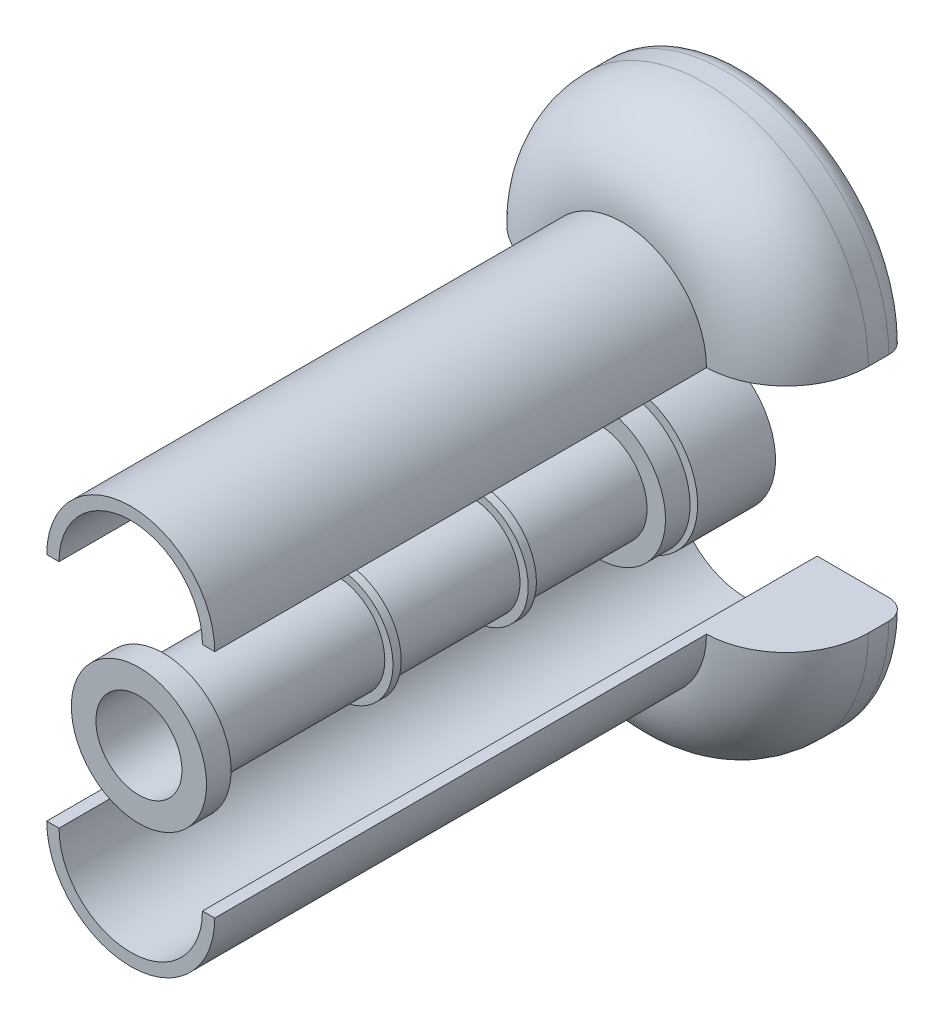
ISO-10303-21;
HEADER;
FILE_DESCRIPTION(('STEP AP214'),'2;1');
FILE_NAME('part.step','',(''),(''),'','','');
FILE_SCHEMA(('AUTOMOTIVE_DESIGN { 1 0 10303 214 1 1 1 1 }'));
ENDSEC;
DATA;
#1=APPLICATION_CONTEXT('core data for automotive mechanical design processes');
#2=APPLICATION_PROTOCOL_DEFINITION('international standard','automotive_design',2000,#1);
#3=PRODUCT_CONTEXT('',#1,'mechanical');
#4=PRODUCT('Part','Part','',(#3));
#5=PRODUCT_RELATED_PRODUCT_CATEGORY('part','',(#4));
#6=PRODUCT_DEFINITION_FORMATION('','',#4);
#7=PRODUCT_DEFINITION_CONTEXT('part definition',#1,'design');
#8=PRODUCT_DEFINITION('design','',#6,#7);
#9=PRODUCT_DEFINITION_SHAPE('','',#8);
#10=(LENGTH_UNIT() NAMED_UNIT(*) SI_UNIT(.MILLI.,.METRE.));
#11=(NAMED_UNIT(*) PLANE_ANGLE_UNIT() SI_UNIT($,.RADIAN.));
#12=(NAMED_UNIT(*) SI_UNIT($,.STERADIAN.) SOLID_ANGLE_UNIT());
#13=UNCERTAINTY_MEASURE_WITH_UNIT(LENGTH_MEASURE(1.E-05),#10,'distance_accuracy_value','');
#14=(GEOMETRIC_REPRESENTATION_CONTEXT(3) GLOBAL_UNCERTAINTY_ASSIGNED_CONTEXT((#13)) GLOBAL_UNIT_ASSIGNED_CONTEXT((#10,
#11,#12)) REPRESENTATION_CONTEXT('',''));
#15=CARTESIAN_POINT('',(0.,0.,0.));
#16=DIRECTION('',(0.,0.,1.));
#17=DIRECTION('',(1.,0.,0.));
#18=AXIS2_PLACEMENT_3D('',#15,#16,#17);
#19=CARTESIAN_POINT('',(0.,-25.237978412694,0.));
#20=DIRECTION('',(0.,1.,0.));
#21=DIRECTION('',(0.,0.,1.));
#22=AXIS2_PLACEMENT_3D('',#19,#20,#21);
#23=PLANE('',#22);
#24=DIRECTION('',(0.,0.,1.));
#25=VECTOR('',#24,1.);
#26=CARTESIAN_POINT('',(17.5,-25.237978412694,-35.));
#27=LINE('',#26,#25);
#28=CARTESIAN_POINT('',(17.5,-25.237978412694,-30.0000000000001));
#29=VERTEX_POINT('',#28);
#30=CARTESIAN_POINT('',(17.5,-25.237978412694,120.));
#31=VERTEX_POINT('',#30);
#32=EDGE_CURVE('E112',#29,#31,#27,.T.);
#33=ORIENTED_EDGE('',*,*,#32,.T.);
#34=DIRECTION('',(-1.,0.,0.));
#35=VECTOR('',#34,1.);
#36=CARTESIAN_POINT('',(0.,-25.237978412694,120.));
#37=LINE('',#36,#35);
#38=CARTESIAN_POINT('',(20.5,-25.237978412694,120.));
#39=VERTEX_POINT('',#38);
#40=EDGE_CURVE('E116',#39,#31,#37,.T.);
#41=ORIENTED_EDGE('',*,*,#40,.F.);
#42=DIRECTION('',(0.,0.,-1.));
#43=VECTOR('',#42,1.);
#44=CARTESIAN_POINT('',(20.5,-25.237978412694,120.));
#45=LINE('',#44,#43);
#46=CARTESIAN_POINT('',(20.5,-25.237978412694,0.));
#47=VERTEX_POINT('',#46);
#48=EDGE_CURVE('E136',#39,#47,#45,.T.);
#49=ORIENTED_EDGE('',*,*,#48,.T.);
#50=DIRECTION('',(-1.,0.,0.));
#51=VECTOR('',#50,1.);
#52=CARTESIAN_POINT('',(0.,-25.237978412694,0.));
#53=LINE('',#52,#51);
#54=CARTESIAN_POINT('',(19.9999999999999,-25.237978412694,0.));
#55=VERTEX_POINT('',#54);
#56=EDGE_CURVE('E143',#47,#55,#53,.T.);
#57=ORIENTED_EDGE('',*,*,#56,.T.);
#58=CARTESIAN_POINT('',(19.9999999999999,-25.237978412694,-20.0000000000001));
#59=DIRECTION('',(0.,1.,0.));
#60=DIRECTION('',(0.,0.,1.));
#61=AXIS2_PLACEMENT_3D('',#58,#59,#60);
#62=CIRCLE('',#61,20.);
#63=CARTESIAN_POINT('',(39.9999999999999,-25.237978412694,-20.0000000000003));
#64=VERTEX_POINT('',#63);
#65=EDGE_CURVE('E153',#64,#55,#62,.F.);
#66=ORIENTED_EDGE('',*,*,#65,.F.);
#67=DIRECTION('',(0.,0.,1.));
#68=VECTOR('',#67,1.);
#69=CARTESIAN_POINT('',(39.9999999999998,-25.237978412694,-30.0000000000003));
#70=LINE('',#69,#68);
#71=CARTESIAN_POINT('',(39.9999999999998,-25.237978412694,-25.0000000000003));
#72=VERTEX_POINT('',#71);
#73=EDGE_CURVE('E159',#64,#72,#70,.F.);
#74=ORIENTED_EDGE('',*,*,#73,.T.);
#75=CARTESIAN_POINT('',(34.9999999999998,-25.237978412694,-25.0000000000002));
#76=DIRECTION('',(0.,1.,0.));
#77=DIRECTION('',(0.,0.,1.));
#78=AXIS2_PLACEMENT_3D('',#75,#76,#77);
#79=CIRCLE('',#78,5.);
#80=CARTESIAN_POINT('',(34.9999999999998,-25.237978412694,-30.0000000000002));
#81=VERTEX_POINT('',#80);
#82=EDGE_CURVE('E69',#81,#72,#79,.F.);
#83=ORIENTED_EDGE('',*,*,#82,.F.);
#84=DIRECTION('',(1.,0.,0.));
#85=VECTOR('',#84,1.);
#86=CARTESIAN_POINT('',(-2.09488880330588E-13,-25.237978412694,-30.));
#87=LINE('',#86,#85);
#88=EDGE_CURVE('E119',#29,#81,#87,.T.);
#89=ORIENTED_EDGE('',*,*,#88,.F.);
#90=EDGE_LOOP('',(#33,#41,#49,#57,#66,#74,#83,#89));
#91=FACE_BOUND('',#90,.T.);
#92=ADVANCED_FACE('F46',(#91),#23,.T.);
#93=CARTESIAN_POINT('',(-20.0000000000001,-25.237978412694,-19.9999999999999));
#94=DIRECTION('',(0.,1.,0.));
#95=DIRECTION('',(0.,0.,1.));
#96=AXIS2_PLACEMENT_3D('',#93,#94,#95);
#97=CIRCLE('',#96,20.);
#98=CARTESIAN_POINT('',(-20.,-25.237978412694,1.39218565815935E-13));
#99=VERTEX_POINT('',#98);
#100=CARTESIAN_POINT('',(-40.0000000000001,-25.237978412694,-19.9999999999997));
#101=VERTEX_POINT('',#100);
#102=EDGE_CURVE('E151',#99,#101,#97,.F.);
#103=ORIENTED_EDGE('',*,*,#102,.F.);
#104=CARTESIAN_POINT('',(-20.5,-25.237978412694,0.));
#105=VERTEX_POINT('',#104);
#106=EDGE_CURVE('E144',#99,#105,#53,.T.);
#107=ORIENTED_EDGE('',*,*,#106,.T.);
#108=DIRECTION('',(0.,0.,-1.));
#109=VECTOR('',#108,1.);
#110=CARTESIAN_POINT('',(-20.5,-25.237978412694,120.));
#111=LINE('',#110,#109);
#112=CARTESIAN_POINT('',(-20.5,-25.237978412694,120.));
#113=VERTEX_POINT('',#112);
#114=EDGE_CURVE('E138',#105,#113,#111,.F.);
#115=ORIENTED_EDGE('',*,*,#114,.T.);
#116=CARTESIAN_POINT('',(-17.5,-25.237978412694,120.));
#117=VERTEX_POINT('',#116);
#118=EDGE_CURVE('E135',#117,#113,#37,.T.);
#119=ORIENTED_EDGE('',*,*,#118,.F.);
#120=DIRECTION('',(0.,0.,1.));
#121=VECTOR('',#120,1.);
#122=CARTESIAN_POINT('',(-17.5,-25.237978412694,-35.));
#123=LINE('',#122,#121);
#124=CARTESIAN_POINT('',(-17.5,-25.237978412694,-29.9999999999999));
#125=VERTEX_POINT('',#124);
#126=EDGE_CURVE('E121',#117,#125,#123,.F.);
#127=ORIENTED_EDGE('',*,*,#126,.T.);
#128=CARTESIAN_POINT('',(-35.0000000000002,-25.237978412694,-29.9999999999998));
#129=VERTEX_POINT('',#128);
#130=EDGE_CURVE('E156',#129,#125,#87,.T.);
#131=ORIENTED_EDGE('',*,*,#130,.F.);
#132=CARTESIAN_POINT('',(-35.0000000000002,-25.237978412694,-24.9999999999998));
#133=DIRECTION('',(0.,1.,0.));
#134=DIRECTION('',(0.,0.,1.));
#135=AXIS2_PLACEMENT_3D('',#132,#133,#134);
#136=CIRCLE('',#135,5.);
#137=CARTESIAN_POINT('',(-40.0000000000002,-25.237978412694,-24.9999999999997));
#138=VERTEX_POINT('',#137);
#139=EDGE_CURVE('E61',#138,#129,#136,.F.);
#140=ORIENTED_EDGE('',*,*,#139,.F.);
#141=DIRECTION('',(0.,0.,1.));
#142=VECTOR('',#141,1.);
#143=CARTESIAN_POINT('',(-40.0000000000002,-25.237978412694,-29.9999999999997));
#144=LINE('',#143,#142);
#145=EDGE_CURVE('E157',#138,#101,#144,.T.);
#146=ORIENTED_EDGE('',*,*,#145,.T.);
#147=EDGE_LOOP('',(#103,#107,#115,#119,#127,#131,#140,#146));
#148=FACE_BOUND('',#147,.T.);
#149=ADVANCED_FACE('F177',(#148),#23,.T.);
#150=CARTESIAN_POINT('',(-1.74574066942157E-13,-25.237978412694,-25.));
#151=DIRECTION('',(0.,0.,-1.));
#152=DIRECTION('',(-1.,0.,0.));
#153=AXIS2_PLACEMENT_3D('',#150,#151,#152);
#154=TOROIDAL_SURFACE('',#153,35.,5.);
#155=CARTESIAN_POINT('',(-2.09488880330588E-13,-25.237978412694,-30.));
#156=DIRECTION('',(0.,0.,-1.));
#157=DIRECTION('',(-1.,0.,0.));
#158=AXIS2_PLACEMENT_3D('',#155,#156,#157);
#159=CIRCLE('',#158,35.);
#160=EDGE_CURVE('E164',#81,#129,#159,.T.);
#161=ORIENTED_EDGE('',*,*,#160,.F.);
#162=ORIENTED_EDGE('',*,*,#82,.T.);
#163=CARTESIAN_POINT('',(-1.74574066942157E-13,-25.237978412694,-25.));
#164=DIRECTION('',(0.,0.,-1.));
#165=DIRECTION('',(-1.,0.,0.));
#166=AXIS2_PLACEMENT_3D('',#163,#164,#165);
#167=CIRCLE('',#166,40.);
#168=EDGE_CURVE('E149',#138,#72,#167,.F.);
#169=ORIENTED_EDGE('',*,*,#168,.F.);
#170=ORIENTED_EDGE('',*,*,#139,.T.);
#171=EDGE_LOOP('',(#161,#162,#169,#170));
#172=FACE_BOUND('',#171,.T.);
#173=ADVANCED_FACE('F179',(#172),#154,.T.);
#174=CARTESIAN_POINT('',(-2.09488880330588E-13,-25.237978412694,-30.));
#175=DIRECTION('',(0.,0.,-1.));
#176=DIRECTION('',(-1.,0.,0.));
#177=AXIS2_PLACEMENT_3D('',#174,#175,#176);
#178=PLANE('',#177);
#179=ORIENTED_EDGE('',*,*,#160,.T.);
#180=ORIENTED_EDGE('',*,*,#130,.T.);
#181=CARTESIAN_POINT('',(0.,-25.237978412694,-30.));
#182=DIRECTION('',(0.,0.,-1.));
#183=DIRECTION('',(-1.,0.,0.));
#184=AXIS2_PLACEMENT_3D('',#181,#182,#183);
#185=CIRCLE('',#184,17.5);
#186=EDGE_CURVE('E13',#29,#125,#185,.T.);
#187=ORIENTED_EDGE('',*,*,#186,.F.);
#188=ORIENTED_EDGE('',*,*,#88,.T.);
#189=EDGE_LOOP('',(#179,#180,#187,#188));
#190=FACE_BOUND('',#189,.T.);
#191=ADVANCED_FACE('F185',(#190),#178,.T.);
#192=CARTESIAN_POINT('',(-2.09488880330588E-13,-25.237978412694,-30.));
#193=DIRECTION('',(0.,0.,1.));
#194=DIRECTION('',(1.,0.,0.));
#195=AXIS2_PLACEMENT_3D('',#192,#193,#194);
#196=CYLINDRICAL_SURFACE('',#195,40.);
#197=ORIENTED_EDGE('',*,*,#145,.F.);
#198=ORIENTED_EDGE('',*,*,#168,.T.);
#199=ORIENTED_EDGE('',*,*,#73,.F.);
#200=CARTESIAN_POINT('',(-1.39659253553725E-13,-25.237978412694,-20.));
#201=DIRECTION('',(0.,0.,-1.));
#202=DIRECTION('',(-1.,0.,0.));
#203=AXIS2_PLACEMENT_3D('',#200,#201,#202);
#204=CIRCLE('',#203,40.);
#205=EDGE_CURVE('E54',#64,#101,#204,.T.);
#206=ORIENTED_EDGE('',*,*,#205,.T.);
#207=EDGE_LOOP('',(#197,#198,#199,#206));
#208=FACE_BOUND('',#207,.T.);
#209=ADVANCED_FACE('F173',(#208),#196,.T.);
#210=CARTESIAN_POINT('',(0.,-25.237978412694,-35.));
#211=DIRECTION('',(0.,0.,1.));
#212=DIRECTION('',(1.,0.,0.));
#213=AXIS2_PLACEMENT_3D('',#210,#211,#212);
#214=CYLINDRICAL_SURFACE('',#213,17.5);
#215=ORIENTED_EDGE('',*,*,#126,.F.);
#216=CARTESIAN_POINT('',(0.,-25.237978412694,120.));
#217=DIRECTION('',(0.,0.,1.));
#218=DIRECTION('',(1.,0.,0.));
#219=AXIS2_PLACEMENT_3D('',#216,#217,#218);
#220=CIRCLE('',#219,17.5);
#221=EDGE_CURVE('E122',#117,#31,#220,.T.);
#222=ORIENTED_EDGE('',*,*,#221,.T.);
#223=ORIENTED_EDGE('',*,*,#32,.F.);
#224=ORIENTED_EDGE('',*,*,#186,.T.);
#225=EDGE_LOOP('',(#215,#222,#223,#224));
#226=FACE_BOUND('',#225,.T.);
#227=ADVANCED_FACE('F125',(#226),#214,.F.);
#228=CARTESIAN_POINT('',(-1.39659253553725E-13,-25.237978412694,-20.));
#229=DIRECTION('',(0.,0.,-1.));
#230=DIRECTION('',(-1.,0.,0.));
#231=AXIS2_PLACEMENT_3D('',#228,#229,#230);
#232=DEGENERATE_TOROIDAL_SURFACE('',#231,20.,20.,.T.);
#233=ORIENTED_EDGE('',*,*,#205,.F.);
#234=ORIENTED_EDGE('',*,*,#65,.T.);
#235=CARTESIAN_POINT('',(0.,-25.237978412694,0.));
#236=DIRECTION('',(0.,0.,-1.));
#237=DIRECTION('',(-1.,0.,0.));
#238=AXIS2_PLACEMENT_3D('',#235,#236,#237);
#239=CIRCLE('',#238,20.);
#240=EDGE_CURVE('E167',#99,#55,#239,.F.);
#241=ORIENTED_EDGE('',*,*,#240,.F.);
#242=ORIENTED_EDGE('',*,*,#102,.T.);
#243=EDGE_LOOP('',(#233,#234,#241,#242));
#244=FACE_BOUND('',#243,.T.);
#245=ADVANCED_FACE('F48',(#244),#232,.T.);
#246=CARTESIAN_POINT('',(0.,-25.237978412694,0.));
#247=DIRECTION('',(0.,0.,1.));
#248=DIRECTION('',(1.,0.,0.));
#249=AXIS2_PLACEMENT_3D('',#246,#247,#248);
#250=PLANE('',#249);
#251=ORIENTED_EDGE('',*,*,#106,.F.);
#252=ORIENTED_EDGE('',*,*,#240,.T.);
#253=ORIENTED_EDGE('',*,*,#56,.F.);
#254=CARTESIAN_POINT('',(0.,-25.237978412694,0.));
#255=DIRECTION('',(0.,0.,1.));
#256=DIRECTION('',(1.,0.,0.));
#257=AXIS2_PLACEMENT_3D('',#254,#255,#256);
#258=CIRCLE('',#257,20.5);
#259=EDGE_CURVE('E129',#105,#47,#258,.T.);
#260=ORIENTED_EDGE('',*,*,#259,.F.);
#261=EDGE_LOOP('',(#251,#252,#253,#260));
#262=FACE_BOUND('',#261,.T.);
#263=ADVANCED_FACE('F187',(#262),#250,.F.);
#264=CARTESIAN_POINT('',(0.,-25.237978412694,120.));
#265=DIRECTION('',(0.,0.,1.));
#266=DIRECTION('',(1.,0.,0.));
#267=AXIS2_PLACEMENT_3D('',#264,#265,#266);
#268=PLANE('',#267);
#269=CARTESIAN_POINT('',(0.,-25.237978412694,120.));
#270=DIRECTION('',(0.,0.,1.));
#271=DIRECTION('',(1.,0.,0.));
#272=AXIS2_PLACEMENT_3D('',#269,#270,#271);
#273=CIRCLE('',#272,20.5);
#274=EDGE_CURVE('E134',#113,#39,#273,.T.);
#275=ORIENTED_EDGE('',*,*,#274,.T.);
#276=ORIENTED_EDGE('',*,*,#40,.T.);
#277=ORIENTED_EDGE('',*,*,#221,.F.);
#278=ORIENTED_EDGE('',*,*,#118,.T.);
#279=EDGE_LOOP('',(#275,#276,#277,#278));
#280=FACE_BOUND('',#279,.T.);
#281=ADVANCED_FACE('F132',(#280),#268,.T.);
#282=CARTESIAN_POINT('',(0.,-25.237978412694,120.));
#283=DIRECTION('',(0.,0.,-1.));
#284=DIRECTION('',(-1.,0.,0.));
#285=AXIS2_PLACEMENT_3D('',#282,#283,#284);
#286=CYLINDRICAL_SURFACE('',#285,20.5);
#287=ORIENTED_EDGE('',*,*,#48,.F.);
#288=ORIENTED_EDGE('',*,*,#274,.F.);
#289=ORIENTED_EDGE('',*,*,#114,.F.);
#290=ORIENTED_EDGE('',*,*,#259,.T.);
#291=EDGE_LOOP('',(#287,#288,#289,#290));
#292=FACE_BOUND('',#291,.T.);
#293=ADVANCED_FACE('F219',(#292),#286,.T.);
#294=CLOSED_SHELL('',(#92,#149,#173,#191,#209,#227,#245,#263,#281,#293));
#295=MANIFOLD_SOLID_BREP('B2',#294);
#296=CARTESIAN_POINT('',(0.,0.,0.));
#297=DIRECTION('',(0.,0.,-1.));
#298=DIRECTION('',(-1.,0.,0.));
#299=AXIS2_PLACEMENT_3D('',#296,#297,#298);
#300=CYLINDRICAL_SURFACE('',#299,2.5);
#301=CARTESIAN_POINT('',(0.,0.,-0.999999999999954));
#302=DIRECTION('',(0.,0.,-1.));
#303=DIRECTION('',(-1.,0.,0.));
#304=AXIS2_PLACEMENT_3D('',#301,#302,#303);
#305=CIRCLE('',#304,2.5);
#306=CARTESIAN_POINT('',(-2.50000000000001,0.,-0.999999999999936));
#307=VERTEX_POINT('',#306);
#308=EDGE_CURVE('E299',#307,#307,#305,.T.);
#309=ORIENTED_EDGE('',*,*,#308,.F.);
#310=EDGE_LOOP('',(#309));
#311=FACE_BOUND('',#310,.T.);
#312=CARTESIAN_POINT('',(0.,0.,-2.99999999999996));
#313=DIRECTION('',(0.,0.,-1.));
#314=DIRECTION('',(-1.,0.,0.));
#315=AXIS2_PLACEMENT_3D('',#312,#313,#314);
#316=CIRCLE('',#315,2.5);
#317=CARTESIAN_POINT('',(-2.50000000000002,0.,-2.99999999999994));
#318=VERTEX_POINT('',#317);
#319=EDGE_CURVE('E305',#318,#318,#316,.F.);
#320=ORIENTED_EDGE('',*,*,#319,.F.);
#321=EDGE_LOOP('',(#320));
#322=FACE_BOUND('',#321,.T.);
#323=ADVANCED_FACE('F286',(#311,#322),#300,.F.);
#324=CARTESIAN_POINT('',(-3.84062947272745E-13,0.,-20.));
#325=DIRECTION('',(0.,0.,1.));
#326=DIRECTION('',(1.,0.,0.));
#327=AXIS2_PLACEMENT_3D('',#324,#325,#326);
#328=CYLINDRICAL_SURFACE('',#327,17.3459245682489);
#329=CARTESIAN_POINT('',(-3.84062947272745E-13,0.,-20.));
#330=DIRECTION('',(0.,0.,-1.));
#331=DIRECTION('',(-1.,0.,0.));
#332=AXIS2_PLACEMENT_3D('',#329,#330,#331);
#333=CIRCLE('',#332,17.3459245682489);
#334=CARTESIAN_POINT('',(-17.3459245682492,0.,-19.9999999999999));
#335=VERTEX_POINT('',#334);
#336=EDGE_CURVE('E45',#335,#335,#333,.T.);
#337=ORIENTED_EDGE('',*,*,#336,.F.);
#338=EDGE_LOOP('',(#337));
#339=FACE_BOUND('',#338,.T.);
#340=CARTESIAN_POINT('',(-2.51386656396705E-13,0.,-0.999999999999954));
#341=DIRECTION('',(0.,0.,-1.));
#342=DIRECTION('',(-1.,0.,0.));
#343=AXIS2_PLACEMENT_3D('',#340,#341,#342);
#344=CIRCLE('',#343,17.3459245682489);
#345=CARTESIAN_POINT('',(-17.3459245682491,0.,-0.999999999999833));
#346=VERTEX_POINT('',#345);
#347=EDGE_CURVE('E294',#346,#346,#344,.T.);
#348=ORIENTED_EDGE('',*,*,#347,.T.);
#349=EDGE_LOOP('',(#348));
#350=FACE_BOUND('',#349,.T.);
#351=ADVANCED_FACE('F288',(#339,#350),#328,.T.);
#352=CARTESIAN_POINT('',(-3.84062947272745E-13,0.,-20.));
#353=DIRECTION('',(0.,0.,-1.));
#354=DIRECTION('',(-1.,0.,0.));
#355=AXIS2_PLACEMENT_3D('',#352,#353,#354);
#356=PLANE('',#355);
#357=CARTESIAN_POINT('',(-1.39659253553725E-13,0.,-20.));
#358=DIRECTION('',(0.,0.,-1.));
#359=DIRECTION('',(-1.,0.,0.));
#360=AXIS2_PLACEMENT_3D('',#357,#358,#359);
#361=CIRCLE('',#360,2.5);
#362=CARTESIAN_POINT('',(-2.50000000000014,0.,-20.));
#363=VERTEX_POINT('',#362);
#364=EDGE_CURVE('E304',#363,#363,#361,.T.);
#365=ORIENTED_EDGE('',*,*,#364,.F.);
#366=EDGE_LOOP('',(#365));
#367=FACE_BOUND('',#366,.T.);
#368=ORIENTED_EDGE('',*,*,#336,.T.);
#369=EDGE_LOOP('',(#368));
#370=FACE_BOUND('',#369,.T.);
#371=ADVANCED_FACE('F323',(#367,#370),#356,.T.);
#372=CARTESIAN_POINT('',(-2.51386656396705E-13,0.,-0.999999999999954));
#373=DIRECTION('',(0.,0.,-1.));
#374=DIRECTION('',(-1.,0.,0.));
#375=AXIS2_PLACEMENT_3D('',#372,#373,#374);
#376=PLANE('',#375);
#377=ORIENTED_EDGE('',*,*,#308,.T.);
#378=EDGE_LOOP('',(#377));
#379=FACE_BOUND('',#378,.T.);
#380=ORIENTED_EDGE('',*,*,#347,.F.);
#381=EDGE_LOOP('',(#380));
#382=FACE_BOUND('',#381,.T.);
#383=ADVANCED_FACE('F325',(#379,#382),#376,.F.);
#384=CARTESIAN_POINT('',(-1.25693328198353E-13,0.,-18.));
#385=DIRECTION('',(0.,0.,-1.));
#386=DIRECTION('',(-1.,0.,0.));
#387=AXIS2_PLACEMENT_3D('',#384,#385,#386);
#388=CIRCLE('',#387,2.5);
#389=CARTESIAN_POINT('',(-2.50000000000013,0.,-18.));
#390=VERTEX_POINT('',#389);
#391=EDGE_CURVE('E290',#390,#390,#388,.F.);
#392=ORIENTED_EDGE('',*,*,#391,.T.);
#393=EDGE_LOOP('',(#392));
#394=FACE_BOUND('',#393,.T.);
#395=ORIENTED_EDGE('',*,*,#364,.T.);
#396=EDGE_LOOP('',(#395));
#397=FACE_BOUND('',#396,.T.);
#398=ADVANCED_FACE('F321',(#394,#397),#300,.F.);
#399=CARTESIAN_POINT('',(-3.70097021917372E-13,0.,-18.));
#400=DIRECTION('',(0.,0.,-1.));
#401=DIRECTION('',(-1.,0.,0.));
#402=AXIS2_PLACEMENT_3D('',#399,#400,#401);
#403=PLANE('',#402);
#404=CARTESIAN_POINT('',(-3.70097021917372E-13,0.,-18.));
#405=DIRECTION('',(0.,0.,-1.));
#406=DIRECTION('',(-1.,0.,0.));
#407=AXIS2_PLACEMENT_3D('',#404,#405,#406);
#408=CIRCLE('',#407,15.);
#409=CARTESIAN_POINT('',(-15.0000000000004,0.,-17.9999999999999));
#410=VERTEX_POINT('',#409);
#411=EDGE_CURVE('E307',#410,#410,#408,.T.);
#412=ORIENTED_EDGE('',*,*,#411,.F.);
#413=EDGE_LOOP('',(#412));
#414=FACE_BOUND('',#413,.T.);
#415=ORIENTED_EDGE('',*,*,#391,.F.);
#416=EDGE_LOOP('',(#415));
#417=FACE_BOUND('',#416,.T.);
#418=ADVANCED_FACE('F342',(#414,#417),#403,.F.);
#419=CARTESIAN_POINT('',(-2.65352581752078E-13,0.,-2.99999999999996));
#420=DIRECTION('',(0.,0.,-1.));
#421=DIRECTION('',(-1.,0.,0.));
#422=AXIS2_PLACEMENT_3D('',#419,#420,#421);
#423=PLANE('',#422);
#424=CARTESIAN_POINT('',(-2.65352581752078E-13,0.,-2.99999999999996));
#425=DIRECTION('',(0.,0.,-1.));
#426=DIRECTION('',(-1.,0.,0.));
#427=AXIS2_PLACEMENT_3D('',#424,#425,#426);
#428=CIRCLE('',#427,15.);
#429=CARTESIAN_POINT('',(-15.0000000000003,0.,-2.99999999999986));
#430=VERTEX_POINT('',#429);
#431=EDGE_CURVE('E312',#430,#430,#428,.T.);
#432=ORIENTED_EDGE('',*,*,#431,.T.);
#433=EDGE_LOOP('',(#432));
#434=FACE_BOUND('',#433,.T.);
#435=ORIENTED_EDGE('',*,*,#319,.T.);
#436=EDGE_LOOP('',(#435));
#437=FACE_BOUND('',#436,.T.);
#438=ADVANCED_FACE('F347',(#434,#437),#423,.T.);
#439=CARTESIAN_POINT('',(-3.70097021917372E-13,0.,-18.));
#440=DIRECTION('',(0.,0.,1.));
#441=DIRECTION('',(1.,0.,0.));
#442=AXIS2_PLACEMENT_3D('',#439,#440,#441);
#443=CYLINDRICAL_SURFACE('',#442,15.);
#444=ORIENTED_EDGE('',*,*,#411,.T.);
#445=EDGE_LOOP('',(#444));
#446=FACE_BOUND('',#445,.T.);
#447=ORIENTED_EDGE('',*,*,#431,.F.);
#448=EDGE_LOOP('',(#447));
#449=FACE_BOUND('',#448,.T.);
#450=ADVANCED_FACE('F355',(#446,#449),#443,.F.);
#451=CLOSED_SHELL('',(#323,#351,#371,#383,#398,#418,#438,#450));
#452=MANIFOLD_SOLID_BREP('B7',#451);
#453=CARTESIAN_POINT('',(0.,0.,118.));
#454=DIRECTION('',(0.,0.,-1.));
#455=DIRECTION('',(-1.,0.,0.));
#456=AXIS2_PLACEMENT_3D('',#453,#454,#455);
#457=CYLINDRICAL_SURFACE('',#456,12.);
#458=CARTESIAN_POINT('',(0.,0.,70.));
#459=DIRECTION('',(0.,0.,1.));
#460=DIRECTION('',(1.,0.,0.));
#461=AXIS2_PLACEMENT_3D('',#458,#459,#460);
#462=CIRCLE('',#461,12.);
#463=CARTESIAN_POINT('',(12.,0.,70.));
#464=VERTEX_POINT('',#463);
#465=EDGE_CURVE('E429',#464,#464,#462,.T.);
#466=ORIENTED_EDGE('',*,*,#465,.T.);
#467=EDGE_LOOP('',(#466));
#468=FACE_BOUND('',#467,.T.);
#469=CARTESIAN_POINT('',(0.,0.,112.));
#470=DIRECTION('',(0.,0.,1.));
#471=DIRECTION('',(1.,0.,0.));
#472=AXIS2_PLACEMENT_3D('',#469,#470,#471);
#473=CIRCLE('',#472,12.);
#474=CARTESIAN_POINT('',(12.,0.,112.));
#475=VERTEX_POINT('',#474);
#476=EDGE_CURVE('E433',#475,#475,#473,.F.);
#477=ORIENTED_EDGE('',*,*,#476,.T.);
#478=EDGE_LOOP('',(#477));
#479=FACE_BOUND('',#478,.T.);
#480=ADVANCED_FACE('F416',(#468,#479),#457,.T.);
#481=CARTESIAN_POINT('',(0.,0.,37.));
#482=DIRECTION('',(0.,0.,-1.));
#483=DIRECTION('',(-1.,0.,0.));
#484=AXIS2_PLACEMENT_3D('',#481,#482,#483);
#485=CYLINDRICAL_SURFACE('',#484,14.);
#486=CARTESIAN_POINT('',(0.,0.,37.));
#487=DIRECTION('',(0.,0.,1.));
#488=DIRECTION('',(1.,0.,0.));
#489=AXIS2_PLACEMENT_3D('',#486,#487,#488);
#490=CIRCLE('',#489,14.);
#491=CARTESIAN_POINT('',(14.,0.,37.));
#492=VERTEX_POINT('',#491);
#493=EDGE_CURVE('E467',#492,#492,#490,.T.);
#494=ORIENTED_EDGE('',*,*,#493,.F.);
#495=EDGE_LOOP('',(#494));
#496=FACE_BOUND('',#495,.T.);
#497=CARTESIAN_POINT('',(0.,0.,35.));
#498=DIRECTION('',(0.,0.,1.));
#499=DIRECTION('',(1.,0.,0.));
#500=AXIS2_PLACEMENT_3D('',#497,#498,#499);
#501=CIRCLE('',#500,14.);
#502=CARTESIAN_POINT('',(14.,0.,35.));
#503=VERTEX_POINT('',#502);
#504=EDGE_CURVE('E464',#503,#503,#501,.T.);
#505=ORIENTED_EDGE('',*,*,#504,.T.);
#506=EDGE_LOOP('',(#505));
#507=FACE_BOUND('',#506,.T.);
#508=ADVANCED_FACE('F472',(#496,#507),#485,.T.);
#509=CARTESIAN_POINT('',(0.,0.,37.));
#510=DIRECTION('',(0.,0.,1.));
#511=DIRECTION('',(1.,0.,0.));
#512=AXIS2_PLACEMENT_3D('',#509,#510,#511);
#513=PLANE('',#512);
#514=CARTESIAN_POINT('',(0.,0.,37.));
#515=DIRECTION('',(0.,0.,1.));
#516=DIRECTION('',(1.,0.,0.));
#517=AXIS2_PLACEMENT_3D('',#514,#515,#516);
#518=CIRCLE('',#517,12.);
#519=CARTESIAN_POINT('',(12.,0.,37.));
#520=VERTEX_POINT('',#519);
#521=EDGE_CURVE('E424',#520,#520,#518,.T.);
#522=ORIENTED_EDGE('',*,*,#521,.F.);
#523=EDGE_LOOP('',(#522));
#524=FACE_BOUND('',#523,.T.);
#525=ORIENTED_EDGE('',*,*,#493,.T.);
#526=EDGE_LOOP('',(#525));
#527=FACE_BOUND('',#526,.T.);
#528=ADVANCED_FACE('F477',(#524,#527),#513,.T.);
#529=CARTESIAN_POINT('',(0.,0.,35.));
#530=DIRECTION('',(0.,0.,1.));
#531=DIRECTION('',(1.,0.,0.));
#532=AXIS2_PLACEMENT_3D('',#529,#530,#531);
#533=PLANE('',#532);
#534=CARTESIAN_POINT('',(0.,0.,35.));
#535=DIRECTION('',(0.,0.,1.));
#536=DIRECTION('',(1.,0.,0.));
#537=AXIS2_PLACEMENT_3D('',#534,#535,#536);
#538=CIRCLE('',#537,12.);
#539=CARTESIAN_POINT('',(12.,0.,35.));
#540=VERTEX_POINT('',#539);
#541=EDGE_CURVE('E457',#540,#540,#538,.T.);
#542=ORIENTED_EDGE('',*,*,#541,.T.);
#543=EDGE_LOOP('',(#542));
#544=FACE_BOUND('',#543,.T.);
#545=ORIENTED_EDGE('',*,*,#504,.F.);
#546=EDGE_LOOP('',(#545));
#547=FACE_BOUND('',#546,.T.);
#548=ADVANCED_FACE('F474',(#544,#547),#533,.F.);
#549=ORIENTED_EDGE('',*,*,#521,.T.);
#550=EDGE_LOOP('',(#549));
#551=FACE_BOUND('',#550,.T.);
#552=CARTESIAN_POINT('',(0.,0.,68.));
#553=DIRECTION('',(0.,0.,1.));
#554=DIRECTION('',(1.,0.,0.));
#555=AXIS2_PLACEMENT_3D('',#552,#553,#554);
#556=CIRCLE('',#555,12.);
#557=CARTESIAN_POINT('',(12.,0.,68.));
#558=VERTEX_POINT('',#557);
#559=EDGE_CURVE('E453',#558,#558,#556,.T.);
#560=ORIENTED_EDGE('',*,*,#559,.F.);
#561=EDGE_LOOP('',(#560));
#562=FACE_BOUND('',#561,.T.);
#563=ADVANCED_FACE('F476',(#551,#562),#457,.T.);
#564=CARTESIAN_POINT('',(0.,0.,6.00000000000003));
#565=DIRECTION('',(0.,0.,1.));
#566=DIRECTION('',(1.,0.,0.));
#567=AXIS2_PLACEMENT_3D('',#564,#565,#566);
#568=CIRCLE('',#567,12.);
#569=CARTESIAN_POINT('',(12.,0.,6.00000000000003));
#570=VERTEX_POINT('',#569);
#571=EDGE_CURVE('E285',#570,#570,#568,.F.);
#572=ORIENTED_EDGE('',*,*,#571,.F.);
#573=EDGE_LOOP('',(#572));
#574=FACE_BOUND('',#573,.T.);
#575=ORIENTED_EDGE('',*,*,#541,.F.);
#576=EDGE_LOOP('',(#575));
#577=FACE_BOUND('',#576,.T.);
#578=ADVANCED_FACE('F484',(#574,#577),#457,.T.);
#579=CARTESIAN_POINT('',(0.,0.,68.));
#580=DIRECTION('',(0.,0.,1.));
#581=DIRECTION('',(1.,0.,0.));
#582=AXIS2_PLACEMENT_3D('',#579,#580,#581);
#583=PLANE('',#582);
#584=ORIENTED_EDGE('',*,*,#559,.T.);
#585=EDGE_LOOP('',(#584));
#586=FACE_BOUND('',#585,.T.);
#587=CARTESIAN_POINT('',(0.,0.,68.));
#588=DIRECTION('',(0.,0.,1.));
#589=DIRECTION('',(1.,0.,0.));
#590=AXIS2_PLACEMENT_3D('',#587,#588,#589);
#591=CIRCLE('',#590,14.);
#592=CARTESIAN_POINT('',(14.,0.,68.));
#593=VERTEX_POINT('',#592);
#594=EDGE_CURVE('E461',#593,#593,#591,.T.);
#595=ORIENTED_EDGE('',*,*,#594,.F.);
#596=EDGE_LOOP('',(#595));
#597=FACE_BOUND('',#596,.T.);
#598=ADVANCED_FACE('F500',(#586,#597),#583,.F.);
#599=CARTESIAN_POINT('',(0.,0.,68.));
#600=DIRECTION('',(0.,0.,1.));
#601=DIRECTION('',(1.,0.,0.));
#602=AXIS2_PLACEMENT_3D('',#599,#600,#601);
#603=CYLINDRICAL_SURFACE('',#602,14.);
#604=ORIENTED_EDGE('',*,*,#594,.T.);
#605=EDGE_LOOP('',(#604));
#606=FACE_BOUND('',#605,.T.);
#607=CARTESIAN_POINT('',(0.,0.,70.));
#608=DIRECTION('',(0.,0.,1.));
#609=DIRECTION('',(1.,0.,0.));
#610=AXIS2_PLACEMENT_3D('',#607,#608,#609);
#611=CIRCLE('',#610,14.);
#612=CARTESIAN_POINT('',(14.,0.,70.));
#613=VERTEX_POINT('',#612);
#614=EDGE_CURVE('E459',#613,#613,#611,.T.);
#615=ORIENTED_EDGE('',*,*,#614,.F.);
#616=EDGE_LOOP('',(#615));
#617=FACE_BOUND('',#616,.T.);
#618=ADVANCED_FACE('F505',(#606,#617),#603,.T.);
#619=CARTESIAN_POINT('',(0.,0.,70.));
#620=DIRECTION('',(0.,0.,1.));
#621=DIRECTION('',(1.,0.,0.));
#622=AXIS2_PLACEMENT_3D('',#619,#620,#621);
#623=PLANE('',#622);
#624=ORIENTED_EDGE('',*,*,#465,.F.);
#625=EDGE_LOOP('',(#624));
#626=FACE_BOUND('',#625,.T.);
#627=ORIENTED_EDGE('',*,*,#614,.T.);
#628=EDGE_LOOP('',(#627));
#629=FACE_BOUND('',#628,.T.);
#630=ADVANCED_FACE('F512',(#626,#629),#623,.T.);
#631=CARTESIAN_POINT('',(0.,0.,6.00000000000003));
#632=DIRECTION('',(0.,0.,-1.));
#633=DIRECTION('',(-1.,0.,0.));
#634=AXIS2_PLACEMENT_3D('',#631,#632,#633);
#635=CYLINDRICAL_SURFACE('',#634,16.5);
#636=CARTESIAN_POINT('',(0.,0.,6.00000000000003));
#637=DIRECTION('',(0.,0.,1.));
#638=DIRECTION('',(1.,0.,0.));
#639=AXIS2_PLACEMENT_3D('',#636,#637,#638);
#640=CIRCLE('',#639,16.5);
#641=CARTESIAN_POINT('',(16.5,0.,6.00000000000003));
#642=VERTEX_POINT('',#641);
#643=EDGE_CURVE('E440',#642,#642,#640,.T.);
#644=ORIENTED_EDGE('',*,*,#643,.F.);
#645=EDGE_LOOP('',(#644));
#646=FACE_BOUND('',#645,.T.);
#647=CARTESIAN_POINT('',(0.,0.,0.));
#648=DIRECTION('',(0.,0.,1.));
#649=DIRECTION('',(1.,0.,0.));
#650=AXIS2_PLACEMENT_3D('',#647,#648,#649);
#651=CIRCLE('',#650,16.5);
#652=CARTESIAN_POINT('',(16.5,0.,0.));
#653=VERTEX_POINT('',#652);
#654=EDGE_CURVE('E435',#653,#653,#651,.T.);
#655=ORIENTED_EDGE('',*,*,#654,.T.);
#656=EDGE_LOOP('',(#655));
#657=FACE_BOUND('',#656,.T.);
#658=ADVANCED_FACE('F518',(#646,#657),#635,.T.);
#659=CARTESIAN_POINT('',(0.,0.,6.00000000000003));
#660=DIRECTION('',(0.,0.,1.));
#661=DIRECTION('',(1.,0.,0.));
#662=AXIS2_PLACEMENT_3D('',#659,#660,#661);
#663=PLANE('',#662);
#664=ORIENTED_EDGE('',*,*,#571,.T.);
#665=EDGE_LOOP('',(#664));
#666=FACE_BOUND('',#665,.T.);
#667=ORIENTED_EDGE('',*,*,#643,.T.);
#668=EDGE_LOOP('',(#667));
#669=FACE_BOUND('',#668,.T.);
#670=ADVANCED_FACE('F523',(#666,#669),#663,.T.);
#671=CARTESIAN_POINT('',(0.,0.,0.));
#672=DIRECTION('',(0.,0.,1.));
#673=DIRECTION('',(1.,0.,0.));
#674=AXIS2_PLACEMENT_3D('',#671,#672,#673);
#675=PLANE('',#674);
#676=ORIENTED_EDGE('',*,*,#654,.F.);
#677=EDGE_LOOP('',(#676));
#678=FACE_BOUND('',#677,.T.);
#679=ADVANCED_FACE('F418',(#678),#675,.F.);
#680=CARTESIAN_POINT('',(0.,0.,112.));
#681=DIRECTION('',(0.,0.,1.));
#682=DIRECTION('',(1.,0.,0.));
#683=AXIS2_PLACEMENT_3D('',#680,#681,#682);
#684=CYLINDRICAL_SURFACE('',#683,16.5);
#685=CARTESIAN_POINT('',(0.,0.,112.));
#686=DIRECTION('',(0.,0.,1.));
#687=DIRECTION('',(1.,0.,0.));
#688=AXIS2_PLACEMENT_3D('',#685,#686,#687);
#689=CIRCLE('',#688,16.5);
#690=CARTESIAN_POINT('',(16.5,0.,112.));
#691=VERTEX_POINT('',#690);
#692=EDGE_CURVE('E436',#691,#691,#689,.T.);
#693=ORIENTED_EDGE('',*,*,#692,.T.);
#694=EDGE_LOOP('',(#693));
#695=FACE_BOUND('',#694,.T.);
#696=CARTESIAN_POINT('',(0.,0.,118.));
#697=DIRECTION('',(0.,0.,1.));
#698=DIRECTION('',(1.,0.,0.));
#699=AXIS2_PLACEMENT_3D('',#696,#697,#698);
#700=CIRCLE('',#699,16.5);
#701=CARTESIAN_POINT('',(16.5,0.,118.));
#702=VERTEX_POINT('',#701);
#703=EDGE_CURVE('E443',#702,#702,#700,.T.);
#704=ORIENTED_EDGE('',*,*,#703,.F.);
#705=EDGE_LOOP('',(#704));
#706=FACE_BOUND('',#705,.T.);
#707=ADVANCED_FACE('F536',(#695,#706),#684,.T.);
#708=CARTESIAN_POINT('',(0.,0.,112.));
#709=DIRECTION('',(0.,0.,1.));
#710=DIRECTION('',(1.,0.,0.));
#711=AXIS2_PLACEMENT_3D('',#708,#709,#710);
#712=PLANE('',#711);
#713=ORIENTED_EDGE('',*,*,#476,.F.);
#714=EDGE_LOOP('',(#713));
#715=FACE_BOUND('',#714,.T.);
#716=ORIENTED_EDGE('',*,*,#692,.F.);
#717=EDGE_LOOP('',(#716));
#718=FACE_BOUND('',#717,.T.);
#719=ADVANCED_FACE('F539',(#715,#718),#712,.F.);
#720=CARTESIAN_POINT('',(0.,0.,118.));
#721=DIRECTION('',(0.,0.,1.));
#722=DIRECTION('',(1.,0.,0.));
#723=AXIS2_PLACEMENT_3D('',#720,#721,#722);
#724=PLANE('',#723);
#725=CARTESIAN_POINT('',(0.,0.,118.));
#726=DIRECTION('',(0.,0.,1.));
#727=DIRECTION('',(1.,0.,0.));
#728=AXIS2_PLACEMENT_3D('',#725,#726,#727);
#729=CIRCLE('',#728,10.5);
#730=CARTESIAN_POINT('',(10.5,0.,118.));
#731=VERTEX_POINT('',#730);
#732=EDGE_CURVE('E420',#731,#731,#729,.F.);
#733=ORIENTED_EDGE('',*,*,#732,.T.);
#734=EDGE_LOOP('',(#733));
#735=FACE_BOUND('',#734,.T.);
#736=ORIENTED_EDGE('',*,*,#703,.T.);
#737=EDGE_LOOP('',(#736));
#738=FACE_BOUND('',#737,.T.);
#739=ADVANCED_FACE('F542',(#735,#738),#724,.T.);
#740=CARTESIAN_POINT('',(0.,0.,120.));
#741=DIRECTION('',(0.,0.,-1.));
#742=DIRECTION('',(-1.,0.,0.));
#743=AXIS2_PLACEMENT_3D('',#740,#741,#742);
#744=CYLINDRICAL_SURFACE('',#743,10.5);
#745=ORIENTED_EDGE('',*,*,#732,.F.);
#746=EDGE_LOOP('',(#745));
#747=FACE_BOUND('',#746,.T.);
#748=CARTESIAN_POINT('',(0.,0.,8.99999999999988));
#749=DIRECTION('',(0.,0.,1.));
#750=DIRECTION('',(1.,0.,0.));
#751=AXIS2_PLACEMENT_3D('',#748,#749,#750);
#752=CIRCLE('',#751,10.5);
#753=CARTESIAN_POINT('',(10.5,0.,8.99999999999988));
#754=VERTEX_POINT('',#753);
#755=EDGE_CURVE('E450',#754,#754,#752,.T.);
#756=ORIENTED_EDGE('',*,*,#755,.F.);
#757=EDGE_LOOP('',(#756));
#758=FACE_BOUND('',#757,.T.);
#759=ADVANCED_FACE('F544',(#747,#758),#744,.F.);
#760=CARTESIAN_POINT('',(0.,0.,8.99999999999988));
#761=DIRECTION('',(0.,0.,1.));
#762=DIRECTION('',(1.,0.,0.));
#763=AXIS2_PLACEMENT_3D('',#760,#761,#762);
#764=PLANE('',#763);
#765=ORIENTED_EDGE('',*,*,#755,.T.);
#766=EDGE_LOOP('',(#765));
#767=FACE_BOUND('',#766,.T.);
#768=ADVANCED_FACE('F547',(#767),#764,.T.);
#769=CLOSED_SHELL('',(#480,#508,#528,#548,#563,#578,#598,#618,#630,#658,#670,#679,#707,#719,
#739,#759,#768));
#770=MANIFOLD_SOLID_BREP('B40',#769);
#771=CARTESIAN_POINT('',(0.,31.0714303598574,0.));
#772=DIRECTION('',(0.,1.,0.));
#773=DIRECTION('',(0.,0.,1.));
#774=AXIS2_PLACEMENT_3D('',#771,#772,#773);
#775=PLANE('',#774);
#776=DIRECTION('',(0.,0.,1.));
#777=VECTOR('',#776,1.);
#778=CARTESIAN_POINT('',(-17.5,31.0714303598574,-35.));
#779=LINE('',#778,#777);
#780=CARTESIAN_POINT('',(-17.5,31.0714303598574,120.));
#781=VERTEX_POINT('',#780);
#782=CARTESIAN_POINT('',(-17.5,31.0714303598574,0.));
#783=VERTEX_POINT('',#782);
#784=EDGE_CURVE('E737',#781,#783,#779,.F.);
#785=ORIENTED_EDGE('',*,*,#784,.F.);
#786=DIRECTION('',(-1.,0.,0.));
#787=VECTOR('',#786,1.);
#788=CARTESIAN_POINT('',(0.,31.0714303598574,120.));
#789=LINE('',#788,#787);
#790=CARTESIAN_POINT('',(-20.5,31.0714303598574,120.));
#791=VERTEX_POINT('',#790);
#792=EDGE_CURVE('E414',#781,#791,#789,.T.);
#793=ORIENTED_EDGE('',*,*,#792,.T.);
#794=DIRECTION('',(0.,0.,-1.));
#795=VECTOR('',#794,1.);
#796=CARTESIAN_POINT('',(-20.5,31.0714303598574,120.));
#797=LINE('',#796,#795);
#798=CARTESIAN_POINT('',(-20.5,31.0714303598574,0.));
#799=VERTEX_POINT('',#798);
#800=EDGE_CURVE('E708',#799,#791,#797,.F.);
#801=ORIENTED_EDGE('',*,*,#800,.F.);
#802=DIRECTION('',(-1.,0.,0.));
#803=VECTOR('',#802,1.);
#804=CARTESIAN_POINT('',(0.,31.0714303598574,0.));
#805=LINE('',#804,#803);
#806=EDGE_CURVE('E751',#783,#799,#805,.T.);
#807=ORIENTED_EDGE('',*,*,#806,.F.);
#808=EDGE_LOOP('',(#785,#793,#801,#807));
#809=FACE_BOUND('',#808,.T.);
#810=ADVANCED_FACE('F685',(#809),#775,.F.);
#811=DIRECTION('',(0.,0.,-1.));
#812=VECTOR('',#811,1.);
#813=CARTESIAN_POINT('',(20.5,31.0714303598574,120.));
#814=LINE('',#813,#812);
#815=CARTESIAN_POINT('',(20.5,31.0714303598574,120.));
#816=VERTEX_POINT('',#815);
#817=CARTESIAN_POINT('',(20.5,31.0714303598574,0.));
#818=VERTEX_POINT('',#817);
#819=EDGE_CURVE('E742',#816,#818,#814,.T.);
#820=ORIENTED_EDGE('',*,*,#819,.F.);
#821=CARTESIAN_POINT('',(17.5,31.0714303598574,120.));
#822=VERTEX_POINT('',#821);
#823=EDGE_CURVE('E693',#816,#822,#789,.T.);
#824=ORIENTED_EDGE('',*,*,#823,.T.);
#825=DIRECTION('',(0.,0.,1.));
#826=VECTOR('',#825,1.);
#827=CARTESIAN_POINT('',(17.5,31.0714303598574,-35.));
#828=LINE('',#827,#826);
#829=CARTESIAN_POINT('',(17.5,31.0714303598574,0.));
#830=VERTEX_POINT('',#829);
#831=EDGE_CURVE('E730',#830,#822,#828,.T.);
#832=ORIENTED_EDGE('',*,*,#831,.F.);
#833=EDGE_CURVE('E688',#818,#830,#805,.T.);
#834=ORIENTED_EDGE('',*,*,#833,.F.);
#835=EDGE_LOOP('',(#820,#824,#832,#834));
#836=FACE_BOUND('',#835,.T.);
#837=ADVANCED_FACE('F740',(#836),#775,.F.);
#838=CARTESIAN_POINT('',(0.,31.0714303598574,-35.));
#839=DIRECTION('',(0.,0.,1.));
#840=DIRECTION('',(1.,0.,0.));
#841=AXIS2_PLACEMENT_3D('',#838,#839,#840);
#842=CYLINDRICAL_SURFACE('',#841,17.5);
#843=CARTESIAN_POINT('',(0.,31.0714303598574,120.));
#844=DIRECTION('',(0.,0.,1.));
#845=DIRECTION('',(1.,0.,0.));
#846=AXIS2_PLACEMENT_3D('',#843,#844,#845);
#847=CIRCLE('',#846,17.5);
#848=EDGE_CURVE('E733',#822,#781,#847,.T.);
#849=ORIENTED_EDGE('',*,*,#848,.T.);
#850=ORIENTED_EDGE('',*,*,#784,.T.);
#851=CARTESIAN_POINT('',(0.,31.0714303598574,0.));
#852=DIRECTION('',(0.,0.,1.));
#853=DIRECTION('',(1.,0.,0.));
#854=AXIS2_PLACEMENT_3D('',#851,#852,#853);
#855=CIRCLE('',#854,17.5);
#856=EDGE_CURVE('E735',#830,#783,#855,.T.);
#857=ORIENTED_EDGE('',*,*,#856,.F.);
#858=ORIENTED_EDGE('',*,*,#831,.T.);
#859=EDGE_LOOP('',(#849,#850,#857,#858));
#860=FACE_BOUND('',#859,.T.);
#861=ADVANCED_FACE('F731',(#860),#842,.F.);
#862=CARTESIAN_POINT('',(0.,31.0714303598574,0.));
#863=DIRECTION('',(0.,0.,1.));
#864=DIRECTION('',(1.,0.,0.));
#865=AXIS2_PLACEMENT_3D('',#862,#863,#864);
#866=PLANE('',#865);
#867=ORIENTED_EDGE('',*,*,#856,.T.);
#868=ORIENTED_EDGE('',*,*,#806,.T.);
#869=CARTESIAN_POINT('',(0.,31.0714303598574,0.));
#870=DIRECTION('',(0.,0.,1.));
#871=DIRECTION('',(1.,0.,0.));
#872=AXIS2_PLACEMENT_3D('',#869,#870,#871);
#873=CIRCLE('',#872,20.5);
#874=EDGE_CURVE('E746',#818,#799,#873,.T.);
#875=ORIENTED_EDGE('',*,*,#874,.F.);
#876=ORIENTED_EDGE('',*,*,#833,.T.);
#877=EDGE_LOOP('',(#867,#868,#875,#876));
#878=FACE_BOUND('',#877,.T.);
#879=ADVANCED_FACE('F756',(#878),#866,.F.);
#880=CARTESIAN_POINT('',(0.,31.0714303598574,120.));
#881=DIRECTION('',(0.,0.,1.));
#882=DIRECTION('',(1.,0.,0.));
#883=AXIS2_PLACEMENT_3D('',#880,#881,#882);
#884=PLANE('',#883);
#885=ORIENTED_EDGE('',*,*,#823,.F.);
#886=CARTESIAN_POINT('',(0.,31.0714303598574,120.));
#887=DIRECTION('',(0.,0.,1.));
#888=DIRECTION('',(1.,0.,0.));
#889=AXIS2_PLACEMENT_3D('',#886,#887,#888);
#890=CIRCLE('',#889,20.5);
#891=EDGE_CURVE('E738',#816,#791,#890,.T.);
#892=ORIENTED_EDGE('',*,*,#891,.T.);
#893=ORIENTED_EDGE('',*,*,#792,.F.);
#894=ORIENTED_EDGE('',*,*,#848,.F.);
#895=EDGE_LOOP('',(#885,#892,#893,#894));
#896=FACE_BOUND('',#895,.T.);
#897=ADVANCED_FACE('F743',(#896),#884,.T.);
#898=CARTESIAN_POINT('',(0.,31.0714303598574,120.));
#899=DIRECTION('',(0.,0.,-1.));
#900=DIRECTION('',(-1.,0.,0.));
#901=AXIS2_PLACEMENT_3D('',#898,#899,#900);
#902=CYLINDRICAL_SURFACE('',#901,20.5);
#903=ORIENTED_EDGE('',*,*,#891,.F.);
#904=ORIENTED_EDGE('',*,*,#819,.T.);
#905=ORIENTED_EDGE('',*,*,#874,.T.);
#906=ORIENTED_EDGE('',*,*,#800,.T.);
#907=EDGE_LOOP('',(#903,#904,#905,#906));
#908=FACE_BOUND('',#907,.T.);
#909=ADVANCED_FACE('F754',(#908),#902,.T.);
#910=CLOSED_SHELL('',(#810,#837,#861,#879,#897,#909));
#911=MANIFOLD_SOLID_BREP('B280',#910);
#912=CARTESIAN_POINT('',(0.,31.0714303598574,0.));
#913=DIRECTION('',(0.,1.,0.));
#914=DIRECTION('',(0.,0.,1.));
#915=AXIS2_PLACEMENT_3D('',#912,#913,#914);
#916=PLANE('',#915);
#917=DIRECTION('',(0.,0.,1.));
#918=VECTOR('',#917,1.);
#919=CARTESIAN_POINT('',(17.5,31.0714303598574,-35.));
#920=LINE('',#919,#918);
#921=CARTESIAN_POINT('',(17.5,31.0714303598574,-30.0000000000001));
#922=VERTEX_POINT('',#921);
#923=CARTESIAN_POINT('',(17.5,31.0714303598574,-1.2220184685951E-13));
#924=VERTEX_POINT('',#923);
#925=EDGE_CURVE('E873',#922,#924,#920,.T.);
#926=ORIENTED_EDGE('',*,*,#925,.F.);
#927=DIRECTION('',(1.,0.,0.));
#928=VECTOR('',#927,1.);
#929=CARTESIAN_POINT('',(-2.09488880330588E-13,31.0714303598574,-30.));
#930=LINE('',#929,#928);
#931=CARTESIAN_POINT('',(34.9999999999998,31.0714303598574,-30.0000000000002));
#932=VERTEX_POINT('',#931);
#933=EDGE_CURVE('E878',#922,#932,#930,.T.);
#934=ORIENTED_EDGE('',*,*,#933,.T.);
#935=CARTESIAN_POINT('',(34.9999999999998,31.0714303598574,-25.0000000000002));
#936=DIRECTION('',(0.,1.,0.));
#937=DIRECTION('',(0.,0.,1.));
#938=AXIS2_PLACEMENT_3D('',#935,#936,#937);
#939=CIRCLE('',#938,5.);
#940=CARTESIAN_POINT('',(39.9999999999998,31.0714303598574,-25.0000000000003));
#941=VERTEX_POINT('',#940);
#942=EDGE_CURVE('E814',#932,#941,#939,.F.);
#943=ORIENTED_EDGE('',*,*,#942,.T.);
#944=DIRECTION('',(0.,0.,1.));
#945=VECTOR('',#944,1.);
#946=CARTESIAN_POINT('',(39.9999999999998,31.0714303598574,-30.0000000000003));
#947=LINE('',#946,#945);
#948=CARTESIAN_POINT('',(39.9999999999999,31.0714303598574,-20.0000000000003));
#949=VERTEX_POINT('',#948);
#950=EDGE_CURVE('E828',#949,#941,#947,.F.);
#951=ORIENTED_EDGE('',*,*,#950,.F.);
#952=CARTESIAN_POINT('',(19.9999999999999,31.0714303598574,-20.0000000000001));
#953=DIRECTION('',(0.,1.,0.));
#954=DIRECTION('',(0.,0.,1.));
#955=AXIS2_PLACEMENT_3D('',#952,#953,#954);
#956=CIRCLE('',#955,20.);
#957=CARTESIAN_POINT('',(20.,31.0714303598574,-1.39218565815935E-13));
#958=VERTEX_POINT('',#957);
#959=EDGE_CURVE('E898',#949,#958,#956,.F.);
#960=ORIENTED_EDGE('',*,*,#959,.T.);
#961=DIRECTION('',(1.,0.,0.));
#962=VECTOR('',#961,1.);
#963=CARTESIAN_POINT('',(0.,31.0714303598574,0.));
#964=LINE('',#963,#962);
#965=EDGE_CURVE('E872',#924,#958,#964,.T.);
#966=ORIENTED_EDGE('',*,*,#965,.F.);
#967=EDGE_LOOP('',(#926,#934,#943,#951,#960,#966));
#968=FACE_BOUND('',#967,.T.);
#969=ADVANCED_FACE('F805',(#968),#916,.F.);
#970=CARTESIAN_POINT('',(-20.0000000000001,31.0714303598574,-19.9999999999999));
#971=DIRECTION('',(0.,1.,0.));
#972=DIRECTION('',(0.,0.,1.));
#973=AXIS2_PLACEMENT_3D('',#970,#971,#972);
#974=CIRCLE('',#973,20.);
#975=CARTESIAN_POINT('',(-20.,31.0714303598574,1.39218565815935E-13));
#976=VERTEX_POINT('',#975);
#977=CARTESIAN_POINT('',(-40.0000000000001,31.0714303598574,-19.9999999999997));
#978=VERTEX_POINT('',#977);
#979=EDGE_CURVE('E896',#976,#978,#974,.F.);
#980=ORIENTED_EDGE('',*,*,#979,.T.);
#981=DIRECTION('',(0.,0.,1.));
#982=VECTOR('',#981,1.);
#983=CARTESIAN_POINT('',(-40.0000000000002,31.0714303598574,-29.9999999999997));
#984=LINE('',#983,#982);
#985=CARTESIAN_POINT('',(-40.0000000000002,31.0714303598574,-24.9999999999997));
#986=VERTEX_POINT('',#985);
#987=EDGE_CURVE('E879',#986,#978,#984,.T.);
#988=ORIENTED_EDGE('',*,*,#987,.F.);
#989=CARTESIAN_POINT('',(-35.0000000000002,31.0714303598574,-24.9999999999998));
#990=DIRECTION('',(0.,1.,0.));
#991=DIRECTION('',(0.,0.,1.));
#992=AXIS2_PLACEMENT_3D('',#989,#990,#991);
#993=CIRCLE('',#992,5.);
#994=CARTESIAN_POINT('',(-35.0000000000002,31.0714303598574,-29.9999999999998));
#995=VERTEX_POINT('',#994);
#996=EDGE_CURVE('E683',#986,#995,#993,.F.);
#997=ORIENTED_EDGE('',*,*,#996,.T.);
#998=CARTESIAN_POINT('',(-17.5,31.0714303598574,-29.9999999999999));
#999=VERTEX_POINT('',#998);
#1000=EDGE_CURVE('E874',#995,#999,#930,.T.);
#1001=ORIENTED_EDGE('',*,*,#1000,.T.);
#1002=DIRECTION('',(0.,0.,1.));
#1003=VECTOR('',#1002,1.);
#1004=CARTESIAN_POINT('',(-17.5,31.0714303598574,-35.));
#1005=LINE('',#1004,#1003);
#1006=CARTESIAN_POINT('',(-17.5,31.0714303598574,1.2220184685951E-13));
#1007=VERTEX_POINT('',#1006);
#1008=EDGE_CURVE('E863',#1007,#999,#1005,.F.);
#1009=ORIENTED_EDGE('',*,*,#1008,.F.);
#1010=EDGE_CURVE('E809',#976,#1007,#964,.T.);
#1011=ORIENTED_EDGE('',*,*,#1010,.F.);
#1012=EDGE_LOOP('',(#980,#988,#997,#1001,#1009,#1011));
#1013=FACE_BOUND('',#1012,.T.);
#1014=ADVANCED_FACE('F807',(#1013),#916,.F.);
#1015=CARTESIAN_POINT('',(-1.74574066942157E-13,31.0714303598574,-25.));
#1016=DIRECTION('',(0.,0.,-1.));
#1017=DIRECTION('',(-1.,0.,0.));
#1018=AXIS2_PLACEMENT_3D('',#1015,#1016,#1017);
#1019=TOROIDAL_SURFACE('',#1018,35.,5.);
#1020=ORIENTED_EDGE('',*,*,#942,.F.);
#1021=CARTESIAN_POINT('',(-2.09488880330588E-13,31.0714303598574,-30.));
#1022=DIRECTION('',(0.,0.,-1.));
#1023=DIRECTION('',(-1.,0.,0.));
#1024=AXIS2_PLACEMENT_3D('',#1021,#1022,#1023);
#1025=CIRCLE('',#1024,35.);
#1026=EDGE_CURVE('E891',#995,#932,#1025,.T.);
#1027=ORIENTED_EDGE('',*,*,#1026,.F.);
#1028=ORIENTED_EDGE('',*,*,#996,.F.);
#1029=CARTESIAN_POINT('',(-1.74574066942157E-13,31.0714303598574,-25.));
#1030=DIRECTION('',(0.,0.,-1.));
#1031=DIRECTION('',(-1.,0.,0.));
#1032=AXIS2_PLACEMENT_3D('',#1029,#1030,#1031);
#1033=CIRCLE('',#1032,40.);
#1034=EDGE_CURVE('E894',#941,#986,#1033,.F.);
#1035=ORIENTED_EDGE('',*,*,#1034,.F.);
#1036=EDGE_LOOP('',(#1020,#1027,#1028,#1035));
#1037=FACE_BOUND('',#1036,.T.);
#1038=ADVANCED_FACE('F913',(#1037),#1019,.T.);
#1039=CARTESIAN_POINT('',(-2.09488880330588E-13,31.0714303598574,-30.));
#1040=DIRECTION('',(0.,0.,-1.));
#1041=DIRECTION('',(-1.,0.,0.));
#1042=AXIS2_PLACEMENT_3D('',#1039,#1040,#1041);
#1043=PLANE('',#1042);
#1044=ORIENTED_EDGE('',*,*,#1000,.F.);
#1045=ORIENTED_EDGE('',*,*,#1026,.T.);
#1046=ORIENTED_EDGE('',*,*,#933,.F.);
#1047=CARTESIAN_POINT('',(0.,31.0714303598574,-30.));
#1048=DIRECTION('',(0.,0.,-1.));
#1049=DIRECTION('',(-1.,0.,0.));
#1050=AXIS2_PLACEMENT_3D('',#1047,#1048,#1049);
#1051=CIRCLE('',#1050,17.5);
#1052=EDGE_CURVE('E868',#999,#922,#1051,.T.);
#1053=ORIENTED_EDGE('',*,*,#1052,.F.);
#1054=EDGE_LOOP('',(#1044,#1045,#1046,#1053));
#1055=FACE_BOUND('',#1054,.T.);
#1056=ADVANCED_FACE('F881',(#1055),#1043,.T.);
#1057=CARTESIAN_POINT('',(-2.09488880330588E-13,31.0714303598574,-30.));
#1058=DIRECTION('',(0.,0.,1.));
#1059=DIRECTION('',(1.,0.,0.));
#1060=AXIS2_PLACEMENT_3D('',#1057,#1058,#1059);
#1061=CYLINDRICAL_SURFACE('',#1060,40.);
#1062=ORIENTED_EDGE('',*,*,#1034,.T.);
#1063=ORIENTED_EDGE('',*,*,#987,.T.);
#1064=CARTESIAN_POINT('',(-1.39659253553725E-13,31.0714303598574,-20.));
#1065=DIRECTION('',(0.,0.,-1.));
#1066=DIRECTION('',(-1.,0.,0.));
#1067=AXIS2_PLACEMENT_3D('',#1064,#1065,#1066);
#1068=CIRCLE('',#1067,40.);
#1069=EDGE_CURVE('E884',#978,#949,#1068,.T.);
#1070=ORIENTED_EDGE('',*,*,#1069,.T.);
#1071=ORIENTED_EDGE('',*,*,#950,.T.);
#1072=EDGE_LOOP('',(#1062,#1063,#1070,#1071));
#1073=FACE_BOUND('',#1072,.T.);
#1074=ADVANCED_FACE('F912',(#1073),#1061,.T.);
#1075=CARTESIAN_POINT('',(0.,31.0714303598574,-35.));
#1076=DIRECTION('',(0.,0.,1.));
#1077=DIRECTION('',(1.,0.,0.));
#1078=AXIS2_PLACEMENT_3D('',#1075,#1076,#1077);
#1079=CYLINDRICAL_SURFACE('',#1078,17.5);
#1080=CARTESIAN_POINT('',(0.,31.0714303598574,0.));
#1081=DIRECTION('',(0.,0.,-1.));
#1082=DIRECTION('',(-1.,0.,0.));
#1083=AXIS2_PLACEMENT_3D('',#1080,#1081,#1082);
#1084=CIRCLE('',#1083,17.5);
#1085=EDGE_CURVE('E870',#1007,#924,#1084,.T.);
#1086=ORIENTED_EDGE('',*,*,#1085,.F.);
#1087=ORIENTED_EDGE('',*,*,#1008,.T.);
#1088=ORIENTED_EDGE('',*,*,#1052,.T.);
#1089=ORIENTED_EDGE('',*,*,#925,.T.);
#1090=EDGE_LOOP('',(#1086,#1087,#1088,#1089));
#1091=FACE_BOUND('',#1090,.T.);
#1092=ADVANCED_FACE('F865',(#1091),#1079,.F.);
#1093=CARTESIAN_POINT('',(0.,31.0714303598574,0.));
#1094=DIRECTION('',(0.,0.,-1.));
#1095=DIRECTION('',(-1.,0.,0.));
#1096=AXIS2_PLACEMENT_3D('',#1093,#1094,#1095);
#1097=PLANE('',#1096);
#1098=CARTESIAN_POINT('',(0.,31.0714303598574,0.));
#1099=DIRECTION('',(0.,0.,-1.));
#1100=DIRECTION('',(-1.,0.,0.));
#1101=AXIS2_PLACEMENT_3D('',#1098,#1099,#1100);
#1102=CIRCLE('',#1101,20.);
#1103=EDGE_CURVE('E886',#958,#976,#1102,.F.);
#1104=ORIENTED_EDGE('',*,*,#1103,.T.);
#1105=ORIENTED_EDGE('',*,*,#1010,.T.);
#1106=ORIENTED_EDGE('',*,*,#1085,.T.);
#1107=ORIENTED_EDGE('',*,*,#965,.T.);
#1108=EDGE_LOOP('',(#1104,#1105,#1106,#1107));
#1109=FACE_BOUND('',#1108,.T.);
#1110=ADVANCED_FACE('F906',(#1109),#1097,.F.);
#1111=CARTESIAN_POINT('',(-1.39659253553725E-13,31.0714303598574,-20.));
#1112=DIRECTION('',(0.,0.,-1.));
#1113=DIRECTION('',(-1.,0.,0.));
#1114=AXIS2_PLACEMENT_3D('',#1111,#1112,#1113);
#1115=DEGENERATE_TOROIDAL_SURFACE('',#1114,20.,20.,.T.);
#1116=ORIENTED_EDGE('',*,*,#959,.F.);
#1117=ORIENTED_EDGE('',*,*,#1069,.F.);
#1118=ORIENTED_EDGE('',*,*,#979,.F.);
#1119=ORIENTED_EDGE('',*,*,#1103,.F.);
#1120=EDGE_LOOP('',(#1116,#1117,#1118,#1119));
#1121=FACE_BOUND('',#1120,.T.);
#1122=ADVANCED_FACE('F911',(#1121),#1115,.T.);
#1123=CLOSED_SHELL('',(#969,#1014,#1038,#1056,#1074,#1092,#1110,#1122));
#1124=MANIFOLD_SOLID_BREP('B408',#1123);
#1125=ADVANCED_BREP_SHAPE_REPRESENTATION('',(#18,#295,#452,#770,#911,#1124),#14);
#1126=SHAPE_DEFINITION_REPRESENTATION(#9,#1125);
ENDSEC;
END-ISO-10303-21;
